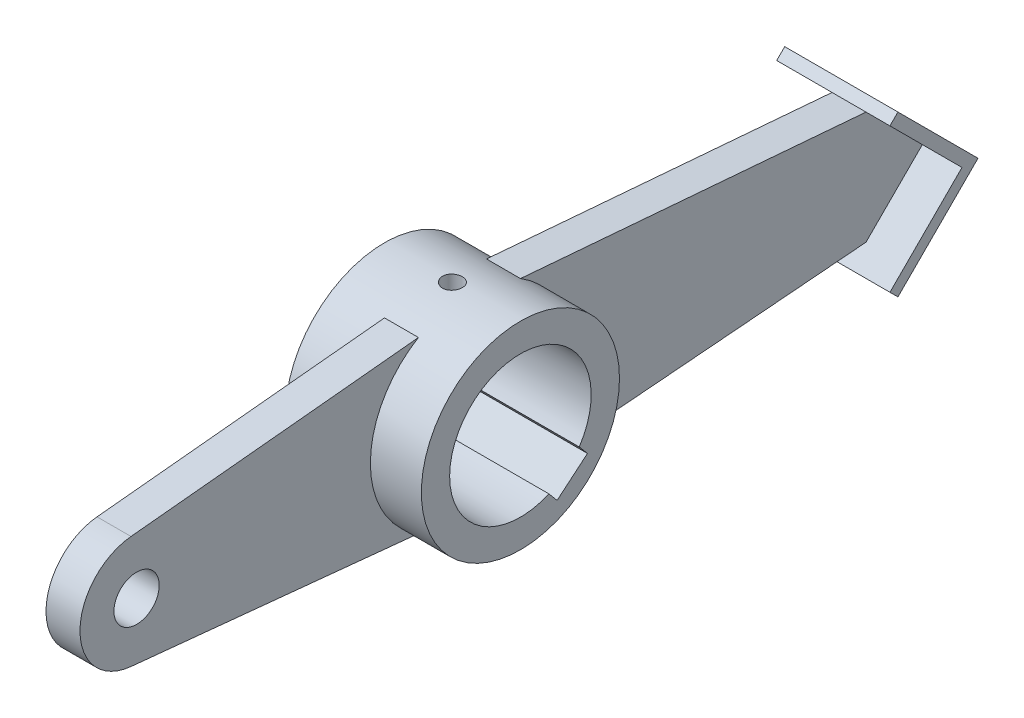
ISO-10303-21;
HEADER;
FILE_DESCRIPTION(('STEP AP214'),'2;1');
FILE_NAME('part.step','',(''),(''),'','','');
FILE_SCHEMA(('AUTOMOTIVE_DESIGN { 1 0 10303 214 1 1 1 1 }'));
ENDSEC;
DATA;
#1=APPLICATION_CONTEXT('core data for automotive mechanical design processes');
#2=APPLICATION_PROTOCOL_DEFINITION('international standard','automotive_design',2000,#1);
#3=PRODUCT_CONTEXT('',#1,'mechanical');
#4=PRODUCT('Part','Part','',(#3));
#5=PRODUCT_RELATED_PRODUCT_CATEGORY('part','',(#4));
#6=PRODUCT_DEFINITION_FORMATION('','',#4);
#7=PRODUCT_DEFINITION_CONTEXT('part definition',#1,'design');
#8=PRODUCT_DEFINITION('design','',#6,#7);
#9=PRODUCT_DEFINITION_SHAPE('','',#8);
#10=(LENGTH_UNIT() NAMED_UNIT(*) SI_UNIT(.MILLI.,.METRE.));
#11=(NAMED_UNIT(*) PLANE_ANGLE_UNIT() SI_UNIT($,.RADIAN.));
#12=(NAMED_UNIT(*) SI_UNIT($,.STERADIAN.) SOLID_ANGLE_UNIT());
#13=UNCERTAINTY_MEASURE_WITH_UNIT(LENGTH_MEASURE(1.E-05),#10,'distance_accuracy_value','');
#14=(GEOMETRIC_REPRESENTATION_CONTEXT(3) GLOBAL_UNCERTAINTY_ASSIGNED_CONTEXT((#13)) GLOBAL_UNIT_ASSIGNED_CONTEXT((#10,
#11,#12)) REPRESENTATION_CONTEXT('',''));
#15=CARTESIAN_POINT('',(0.,0.,0.));
#16=DIRECTION('',(0.,0.,1.));
#17=DIRECTION('',(1.,0.,0.));
#18=AXIS2_PLACEMENT_3D('',#15,#16,#17);
#19=CARTESIAN_POINT('',(20.,0.,-160.));
#20=DIRECTION('',(0.,0.707106781186547,-0.707106781186548));
#21=DIRECTION('',(0.,0.707106781186548,0.707106781186547));
#22=AXIS2_PLACEMENT_3D('',#19,#20,#21);
#23=PLANE('',#22);
#24=DIRECTION('',(0.,-0.707106781186548,-0.707106781186547));
#25=VECTOR('',#24,1.);
#26=CARTESIAN_POINT('',(-20.,0.,-160.));
#27=LINE('',#26,#25);
#28=CARTESIAN_POINT('',(-20.,25.4558441227157,-134.544155877284));
#29=VERTEX_POINT('',#28);
#30=CARTESIAN_POINT('',(-20.,0.,-160.));
#31=VERTEX_POINT('',#30);
#32=EDGE_CURVE('E130',#29,#31,#27,.T.);
#33=ORIENTED_EDGE('',*,*,#32,.T.);
#34=DIRECTION('',(-1.,0.,0.));
#35=VECTOR('',#34,1.);
#36=CARTESIAN_POINT('',(20.,0.,-160.));
#37=LINE('',#36,#35);
#38=CARTESIAN_POINT('',(20.,0.,-160.));
#39=VERTEX_POINT('',#38);
#40=EDGE_CURVE('E12',#39,#31,#37,.T.);
#41=ORIENTED_EDGE('',*,*,#40,.F.);
#42=DIRECTION('',(0.,-0.707106781186548,-0.707106781186547));
#43=VECTOR('',#42,1.);
#44=CARTESIAN_POINT('',(20.,0.,-160.));
#45=LINE('',#44,#43);
#46=CARTESIAN_POINT('',(20.,25.4558441227157,-134.544155877284));
#47=VERTEX_POINT('',#46);
#48=EDGE_CURVE('E140',#47,#39,#45,.T.);
#49=ORIENTED_EDGE('',*,*,#48,.F.);
#50=DIRECTION('',(-1.,0.,0.));
#51=VECTOR('',#50,1.);
#52=CARTESIAN_POINT('',(20.,25.4558441227157,-134.544155877284));
#53=LINE('',#52,#51);
#54=EDGE_CURVE('E126',#47,#29,#53,.T.);
#55=ORIENTED_EDGE('',*,*,#54,.T.);
#56=EDGE_LOOP('',(#33,#41,#49,#55));
#57=FACE_BOUND('',#56,.T.);
#58=ADVANCED_FACE('F46',(#57),#23,.F.);
#59=CARTESIAN_POINT('',(20.,-25.4558441227157,-134.544155877284));
#60=DIRECTION('',(0.,-0.707106781186547,-0.707106781186548));
#61=DIRECTION('',(0.,0.707106781186548,-0.707106781186547));
#62=AXIS2_PLACEMENT_3D('',#59,#60,#61);
#63=PLANE('',#62);
#64=DIRECTION('',(0.,-0.707106781186548,0.707106781186547));
#65=VECTOR('',#64,1.);
#66=CARTESIAN_POINT('',(-20.,-25.4558441227157,-134.544155877284));
#67=LINE('',#66,#65);
#68=CARTESIAN_POINT('',(-20.,-25.4558441227157,-134.544155877284));
#69=VERTEX_POINT('',#68);
#70=EDGE_CURVE('E133',#31,#69,#67,.T.);
#71=ORIENTED_EDGE('',*,*,#70,.T.);
#72=DIRECTION('',(-1.,0.,0.));
#73=VECTOR('',#72,1.);
#74=CARTESIAN_POINT('',(20.,-25.4558441227157,-134.544155877284));
#75=LINE('',#74,#73);
#76=CARTESIAN_POINT('',(20.,-25.4558441227157,-134.544155877284));
#77=VERTEX_POINT('',#76);
#78=EDGE_CURVE('E54',#77,#69,#75,.T.);
#79=ORIENTED_EDGE('',*,*,#78,.F.);
#80=DIRECTION('',(0.,-0.707106781186548,0.707106781186547));
#81=VECTOR('',#80,1.);
#82=CARTESIAN_POINT('',(20.,-25.4558441227157,-134.544155877284));
#83=LINE('',#82,#81);
#84=EDGE_CURVE('E99',#39,#77,#83,.T.);
#85=ORIENTED_EDGE('',*,*,#84,.F.);
#86=ORIENTED_EDGE('',*,*,#40,.T.);
#87=EDGE_LOOP('',(#71,#79,#85,#86));
#88=FACE_BOUND('',#87,.T.);
#89=ADVANCED_FACE('F164',(#88),#63,.F.);
#90=CARTESIAN_POINT('',(20.,-28.2842712474619,-137.372583002031));
#91=DIRECTION('',(0.,0.70710678118655,-0.707106781186545));
#92=DIRECTION('',(0.,0.707106781186545,0.70710678118655));
#93=AXIS2_PLACEMENT_3D('',#90,#91,#92);
#94=PLANE('',#93);
#95=DIRECTION('',(0.,-0.707106781186545,-0.70710678118655));
#96=VECTOR('',#95,1.);
#97=CARTESIAN_POINT('',(-20.,-28.2842712474619,-137.372583002031));
#98=LINE('',#97,#96);
#99=CARTESIAN_POINT('',(-20.,-28.2842712474619,-137.372583002031));
#100=VERTEX_POINT('',#99);
#101=EDGE_CURVE('E135',#69,#100,#98,.T.);
#102=ORIENTED_EDGE('',*,*,#101,.T.);
#103=DIRECTION('',(-1.,0.,0.));
#104=VECTOR('',#103,1.);
#105=CARTESIAN_POINT('',(20.,-28.2842712474619,-137.372583002031));
#106=LINE('',#105,#104);
#107=CARTESIAN_POINT('',(20.,-28.2842712474619,-137.372583002031));
#108=VERTEX_POINT('',#107);
#109=EDGE_CURVE('E121',#108,#100,#106,.T.);
#110=ORIENTED_EDGE('',*,*,#109,.F.);
#111=DIRECTION('',(0.,-0.707106781186545,-0.70710678118655));
#112=VECTOR('',#111,1.);
#113=CARTESIAN_POINT('',(20.,-28.2842712474619,-137.372583002031));
#114=LINE('',#113,#112);
#115=EDGE_CURVE('E112',#77,#108,#114,.T.);
#116=ORIENTED_EDGE('',*,*,#115,.F.);
#117=ORIENTED_EDGE('',*,*,#78,.T.);
#118=EDGE_LOOP('',(#102,#110,#116,#117));
#119=FACE_BOUND('',#118,.T.);
#120=ADVANCED_FACE('F146',(#119),#94,.F.);
#121=CARTESIAN_POINT('',(20.,0.,-165.656854249492));
#122=DIRECTION('',(0.,0.707106781186548,0.707106781186547));
#123=DIRECTION('',(0.,-0.707106781186547,0.707106781186548));
#124=AXIS2_PLACEMENT_3D('',#121,#122,#123);
#125=PLANE('',#124);
#126=DIRECTION('',(0.,0.707106781186547,-0.707106781186548));
#127=VECTOR('',#126,1.);
#128=CARTESIAN_POINT('',(-20.,0.,-165.656854249492));
#129=LINE('',#128,#127);
#130=CARTESIAN_POINT('',(-20.,0.,-165.656854249492));
#131=VERTEX_POINT('',#130);
#132=EDGE_CURVE('E120',#100,#131,#129,.T.);
#133=ORIENTED_EDGE('',*,*,#132,.T.);
#134=DIRECTION('',(-1.,0.,0.));
#135=VECTOR('',#134,1.);
#136=CARTESIAN_POINT('',(20.,0.,-165.656854249492));
#137=LINE('',#136,#135);
#138=CARTESIAN_POINT('',(20.,0.,-165.656854249492));
#139=VERTEX_POINT('',#138);
#140=EDGE_CURVE('E117',#139,#131,#137,.T.);
#141=ORIENTED_EDGE('',*,*,#140,.F.);
#142=DIRECTION('',(0.,0.707106781186547,-0.707106781186548));
#143=VECTOR('',#142,1.);
#144=CARTESIAN_POINT('',(20.,0.,-165.656854249492));
#145=LINE('',#144,#143);
#146=EDGE_CURVE('E106',#108,#139,#145,.T.);
#147=ORIENTED_EDGE('',*,*,#146,.F.);
#148=ORIENTED_EDGE('',*,*,#109,.T.);
#149=EDGE_LOOP('',(#133,#141,#147,#148));
#150=FACE_BOUND('',#149,.T.);
#151=ADVANCED_FACE('F118',(#150),#125,.F.);
#152=CARTESIAN_POINT('',(20.,28.2842712474619,-137.37258300203));
#153=DIRECTION('',(0.,-0.707106781186548,0.707106781186547));
#154=DIRECTION('',(0.,-0.707106781186547,-0.707106781186548));
#155=AXIS2_PLACEMENT_3D('',#152,#153,#154);
#156=PLANE('',#155);
#157=DIRECTION('',(0.,0.707106781186547,0.707106781186548));
#158=VECTOR('',#157,1.);
#159=CARTESIAN_POINT('',(-20.,28.2842712474619,-137.37258300203));
#160=LINE('',#159,#158);
#161=CARTESIAN_POINT('',(-20.,28.2842712474619,-137.37258300203));
#162=VERTEX_POINT('',#161);
#163=EDGE_CURVE('E85',#131,#162,#160,.T.);
#164=ORIENTED_EDGE('',*,*,#163,.T.);
#165=DIRECTION('',(-1.,0.,0.));
#166=VECTOR('',#165,1.);
#167=CARTESIAN_POINT('',(20.,28.2842712474619,-137.37258300203));
#168=LINE('',#167,#166);
#169=CARTESIAN_POINT('',(20.,28.2842712474619,-137.37258300203));
#170=VERTEX_POINT('',#169);
#171=EDGE_CURVE('E122',#170,#162,#168,.T.);
#172=ORIENTED_EDGE('',*,*,#171,.F.);
#173=DIRECTION('',(0.,0.707106781186547,0.707106781186548));
#174=VECTOR('',#173,1.);
#175=CARTESIAN_POINT('',(20.,28.2842712474619,-137.37258300203));
#176=LINE('',#175,#174);
#177=EDGE_CURVE('E110',#139,#170,#176,.T.);
#178=ORIENTED_EDGE('',*,*,#177,.F.);
#179=ORIENTED_EDGE('',*,*,#140,.T.);
#180=EDGE_LOOP('',(#164,#172,#178,#179));
#181=FACE_BOUND('',#180,.T.);
#182=ADVANCED_FACE('F124',(#181),#156,.F.);
#183=CARTESIAN_POINT('',(20.,25.4558441227157,-134.544155877284));
#184=DIRECTION('',(0.,-0.707106781186542,-0.707106781186553));
#185=DIRECTION('',(0.,0.707106781186553,-0.707106781186542));
#186=AXIS2_PLACEMENT_3D('',#183,#184,#185);
#187=PLANE('',#186);
#188=DIRECTION('',(0.,-0.707106781186553,0.707106781186542));
#189=VECTOR('',#188,1.);
#190=CARTESIAN_POINT('',(-20.,25.4558441227157,-134.544155877284));
#191=LINE('',#190,#189);
#192=EDGE_CURVE('E91',#162,#29,#191,.T.);
#193=ORIENTED_EDGE('',*,*,#192,.T.);
#194=ORIENTED_EDGE('',*,*,#54,.F.);
#195=DIRECTION('',(0.,-0.707106781186553,0.707106781186542));
#196=VECTOR('',#195,1.);
#197=CARTESIAN_POINT('',(20.,25.4558441227157,-134.544155877284));
#198=LINE('',#197,#196);
#199=EDGE_CURVE('E62',#170,#47,#198,.T.);
#200=ORIENTED_EDGE('',*,*,#199,.F.);
#201=ORIENTED_EDGE('',*,*,#171,.T.);
#202=EDGE_LOOP('',(#193,#194,#200,#201));
#203=FACE_BOUND('',#202,.T.);
#204=ADVANCED_FACE('F153',(#203),#187,.F.);
#205=CARTESIAN_POINT('',(20.,0.,0.));
#206=DIRECTION('',(-1.,0.,0.));
#207=DIRECTION('',(0.,0.,1.));
#208=AXIS2_PLACEMENT_3D('',#205,#206,#207);
#209=PLANE('',#208);
#210=ORIENTED_EDGE('',*,*,#48,.T.);
#211=ORIENTED_EDGE('',*,*,#84,.T.);
#212=ORIENTED_EDGE('',*,*,#115,.T.);
#213=ORIENTED_EDGE('',*,*,#146,.T.);
#214=ORIENTED_EDGE('',*,*,#177,.T.);
#215=ORIENTED_EDGE('',*,*,#199,.T.);
#216=EDGE_LOOP('',(#210,#211,#212,#213,#214,#215));
#217=FACE_BOUND('',#216,.T.);
#218=ADVANCED_FACE('F108',(#217),#209,.F.);
#219=CARTESIAN_POINT('',(-20.,0.,0.));
#220=DIRECTION('',(-1.,0.,0.));
#221=DIRECTION('',(0.,0.,1.));
#222=AXIS2_PLACEMENT_3D('',#219,#220,#221);
#223=PLANE('',#222);
#224=ORIENTED_EDGE('',*,*,#32,.F.);
#225=ORIENTED_EDGE('',*,*,#192,.F.);
#226=ORIENTED_EDGE('',*,*,#163,.F.);
#227=ORIENTED_EDGE('',*,*,#132,.F.);
#228=ORIENTED_EDGE('',*,*,#101,.F.);
#229=ORIENTED_EDGE('',*,*,#70,.F.);
#230=EDGE_LOOP('',(#224,#225,#226,#227,#228,#229));
#231=FACE_BOUND('',#230,.T.);
#232=ADVANCED_FACE('F149',(#231),#223,.T.);
#233=CLOSED_SHELL('',(#58,#89,#120,#151,#182,#204,#218,#232));
#234=MANIFOLD_SOLID_BREP('B2',#233);
#235=CARTESIAN_POINT('',(24.,0.,0.));
#236=DIRECTION('',(1.,0.,0.));
#237=DIRECTION('',(0.,0.,-1.));
#238=AXIS2_PLACEMENT_3D('',#235,#236,#237);
#239=PLANE('',#238);
#240=DIRECTION('',(0.,0.76604444311897,0.642787609686549));
#241=VECTOR('',#240,1.);
#242=CARTESIAN_POINT('',(24.,-6.65561581062619,-14.7225757972803));
#243=LINE('',#242,#241);
#244=CARTESIAN_POINT('',(24.,-17.3327533610848,-23.6817579778994));
#245=VERTEX_POINT('',#244);
#246=CARTESIAN_POINT('',(24.,-13.8855533670494,-20.78921373431));
#247=VERTEX_POINT('',#246);
#248=EDGE_CURVE('E347',#245,#247,#243,.T.);
#249=ORIENTED_EDGE('',*,*,#248,.F.);
#250=DIRECTION('',(0.,0.642787609686549,-0.76604444311897));
#251=VECTOR('',#250,1.);
#252=CARTESIAN_POINT('',(24.,-17.3327533610848,-23.6817579778994));
#253=LINE('',#252,#251);
#254=CARTESIAN_POINT('',(24.,-26.3317798966965,-12.9571357742339));
#255=VERTEX_POINT('',#254);
#256=EDGE_CURVE('E343',#255,#245,#253,.T.);
#257=ORIENTED_EDGE('',*,*,#256,.F.);
#258=DIRECTION('',(0.,-0.76604444311897,-0.642787609686549));
#259=VECTOR('',#258,1.);
#260=CARTESIAN_POINT('',(24.,-26.3317798966965,-12.9571357742339));
#261=LINE('',#260,#259);
#262=CARTESIAN_POINT('',(24.,-22.8845799026611,-10.0645915306444));
#263=VERTEX_POINT('',#262);
#264=EDGE_CURVE('E324',#263,#255,#261,.T.);
#265=ORIENTED_EDGE('',*,*,#264,.F.);
#266=CARTESIAN_POINT('',(24.,0.,0.));
#267=DIRECTION('',(1.,0.,0.));
#268=DIRECTION('',(0.,0.,-1.));
#269=AXIS2_PLACEMENT_3D('',#266,#267,#268);
#270=CIRCLE('',#269,25.);
#271=EDGE_CURVE('E424',#247,#263,#270,.T.);
#272=ORIENTED_EDGE('',*,*,#271,.F.);
#273=EDGE_LOOP('',(#249,#257,#265,#272));
#274=FACE_BOUND('',#273,.T.);
#275=CARTESIAN_POINT('',(24.,0.,0.));
#276=DIRECTION('',(1.,0.,0.));
#277=DIRECTION('',(0.,0.,-1.));
#278=AXIS2_PLACEMENT_3D('',#275,#276,#277);
#279=CIRCLE('',#278,35.);
#280=CARTESIAN_POINT('',(24.,0.,-35.));
#281=VERTEX_POINT('',#280);
#282=EDGE_CURVE('E429',#281,#281,#279,.T.);
#283=ORIENTED_EDGE('',*,*,#282,.T.);
#284=EDGE_LOOP('',(#283));
#285=FACE_BOUND('',#284,.T.);
#286=ADVANCED_FACE('F221',(#274,#285),#239,.T.);
#287=CARTESIAN_POINT('',(-24.,0.,0.));
#288=DIRECTION('',(1.,0.,0.));
#289=DIRECTION('',(0.,0.,-1.));
#290=AXIS2_PLACEMENT_3D('',#287,#288,#289);
#291=PLANE('',#290);
#292=CARTESIAN_POINT('',(-24.,0.,0.));
#293=DIRECTION('',(1.,0.,0.));
#294=DIRECTION('',(0.,0.,-1.));
#295=AXIS2_PLACEMENT_3D('',#292,#293,#294);
#296=CIRCLE('',#295,35.);
#297=CARTESIAN_POINT('',(-24.,0.,-35.));
#298=VERTEX_POINT('',#297);
#299=EDGE_CURVE('E427',#298,#298,#296,.T.);
#300=ORIENTED_EDGE('',*,*,#299,.F.);
#301=EDGE_LOOP('',(#300));
#302=FACE_BOUND('',#301,.T.);
#303=DIRECTION('',(0.,0.642787609686549,-0.76604444311897));
#304=VECTOR('',#303,1.);
#305=CARTESIAN_POINT('',(-24.,-17.3327533610848,-23.6817579778994));
#306=LINE('',#305,#304);
#307=CARTESIAN_POINT('',(-24.,-26.3317798966965,-12.9571357742339));
#308=VERTEX_POINT('',#307);
#309=CARTESIAN_POINT('',(-24.,-17.3327533610848,-23.6817579778994));
#310=VERTEX_POINT('',#309);
#311=EDGE_CURVE('E329',#308,#310,#306,.T.);
#312=ORIENTED_EDGE('',*,*,#311,.T.);
#313=DIRECTION('',(0.,0.76604444311897,0.642787609686549));
#314=VECTOR('',#313,1.);
#315=CARTESIAN_POINT('',(-24.,-6.65561581062619,-14.7225757972803));
#316=LINE('',#315,#314);
#317=CARTESIAN_POINT('',(-24.,-13.8855533670494,-20.78921373431));
#318=VERTEX_POINT('',#317);
#319=EDGE_CURVE('E341',#310,#318,#316,.T.);
#320=ORIENTED_EDGE('',*,*,#319,.T.);
#321=CARTESIAN_POINT('',(-24.,0.,0.));
#322=DIRECTION('',(1.,0.,0.));
#323=DIRECTION('',(0.,0.,-1.));
#324=AXIS2_PLACEMENT_3D('',#321,#322,#323);
#325=CIRCLE('',#324,25.);
#326=CARTESIAN_POINT('',(-24.,-22.8845799026611,-10.0645915306444));
#327=VERTEX_POINT('',#326);
#328=EDGE_CURVE('E340',#318,#327,#325,.T.);
#329=ORIENTED_EDGE('',*,*,#328,.T.);
#330=DIRECTION('',(0.,-0.76604444311897,-0.642787609686549));
#331=VECTOR('',#330,1.);
#332=CARTESIAN_POINT('',(-24.,-26.3317798966965,-12.9571357742339));
#333=LINE('',#332,#331);
#334=EDGE_CURVE('E243',#327,#308,#333,.T.);
#335=ORIENTED_EDGE('',*,*,#334,.T.);
#336=EDGE_LOOP('',(#312,#320,#329,#335));
#337=FACE_BOUND('',#336,.T.);
#338=ADVANCED_FACE('F338',(#302,#337),#291,.F.);
#339=CARTESIAN_POINT('',(24.,0.,0.));
#340=DIRECTION('',(-1.,0.,0.));
#341=DIRECTION('',(0.,0.,1.));
#342=AXIS2_PLACEMENT_3D('',#339,#340,#341);
#343=CYLINDRICAL_SURFACE('',#342,35.);
#344=CARTESIAN_POINT('',(0.,34.8245602987317,3.49999999999988));
#345=CARTESIAN_POINT('',(-0.196068474615196,34.8245625976248,3.4999915068767));
#346=CARTESIAN_POINT('',(-0.392266589464245,34.8262339934706,3.48346900643453));
#347=CARTESIAN_POINT('',(-0.779223152048499,34.8327380631546,3.41780710166835));
#348=CARTESIAN_POINT('',(-0.969975363135411,34.8375742207731,3.36863175210201));
#349=CARTESIAN_POINT('',(-1.34038036725521,34.8498546570279,3.23911040624265));
#350=CARTESIAN_POINT('',(-1.52003981286804,34.8572973542366,3.15878330702893));
#351=CARTESIAN_POINT('',(-1.86328727302312,34.8739503199148,2.96927493586832));
#352=CARTESIAN_POINT('',(-2.02687847069355,34.883160237225,2.86009939469051));
#353=CARTESIAN_POINT('',(-2.33397942280071,34.9023474348731,2.61556666699545));
#354=CARTESIAN_POINT('',(-2.4774225332631,34.9123271001915,2.48012596337881));
#355=CARTESIAN_POINT('',(-2.73958163151263,34.931907683243,2.18708600361832));
#356=CARTESIAN_POINT('',(-2.85829648792213,34.9415085836306,2.02948573417286));
#357=CARTESIAN_POINT('',(-3.06785939952499,34.9592734104481,1.69619226577834));
#358=CARTESIAN_POINT('',(-3.15864849577781,34.9674342813132,1.52046181885337));
#359=CARTESIAN_POINT('',(-3.3094055160204,34.9813735906515,1.15615494500616));
#360=CARTESIAN_POINT('',(-3.36937419129314,34.9871520871971,0.967578831338643));
#361=CARTESIAN_POINT('',(-3.45659268273637,34.995658829986,0.583606739600202));
#362=CARTESIAN_POINT('',(-3.48395191462481,34.9983972744986,0.388235844610414));
#363=CARTESIAN_POINT('',(-3.50551344196801,35.0005500459542,-0.00434259241142233));
#364=CARTESIAN_POINT('',(-3.49971659711196,34.9999644590845,-0.201550086690736));
#365=CARTESIAN_POINT('',(-3.45521934572445,34.9955434958915,-0.591460954226082));
#366=CARTESIAN_POINT('',(-3.41663659552638,34.99171974031,-0.784177904772548));
#367=CARTESIAN_POINT('',(-3.30784604868683,34.9812655242726,-1.16038712826599));
#368=CARTESIAN_POINT('',(-3.2376378412435,34.9746350273584,-1.34387928135217));
#369=CARTESIAN_POINT('',(-3.06746032860946,34.959292811937,-1.69680110137867));
#370=CARTESIAN_POINT('',(-2.96743895864445,34.9505774578015,-1.8662054984359));
#371=CARTESIAN_POINT('',(-2.74051216832271,34.9320434581793,-2.1858672961098));
#372=CARTESIAN_POINT('',(-2.61360595949186,34.9222247803384,-2.33612413496302));
#373=CARTESIAN_POINT('',(-2.33585019670224,34.9025352713748,-2.61391470137953));
#374=CARTESIAN_POINT('',(-2.18489829340448,34.892664400056,-2.74134611166633));
#375=CARTESIAN_POINT('',(-1.86369097176228,34.8740258974878,-2.96907637375283));
#376=CARTESIAN_POINT('',(-1.6934355254175,34.8652582678387,-3.06937518619524));
#377=CARTESIAN_POINT('',(-1.33837541180073,34.8498181329952,-3.23999264600643));
#378=CARTESIAN_POINT('',(-1.15356768651989,34.8431460696394,-3.31030497200548));
#379=CARTESIAN_POINT('',(-0.77468788384859,34.8326615654828,-3.41887257473168));
#380=CARTESIAN_POINT('',(-0.580616088893944,34.8288490375619,-3.45712882810074));
#381=CARTESIAN_POINT('',(-0.189615371646723,34.8245303184596,-3.50036671387198));
#382=CARTESIAN_POINT('',(0.00729757092691552,34.8240099041661,-3.50549148826536));
#383=CARTESIAN_POINT('',(0.39917943038002,34.826296797417,-3.48269686404989));
#384=CARTESIAN_POINT('',(0.594148373491285,34.8291040599971,-3.45477791193426));
#385=CARTESIAN_POINT('',(0.976190537974195,34.8377170547841,-3.36680811077644));
#386=CARTESIAN_POINT('',(1.16327949883131,34.8435164700471,-3.3068249451613));
#387=CARTESIAN_POINT('',(1.52474018105607,34.8574551863578,-3.15649851886591));
#388=CARTESIAN_POINT('',(1.69911161100514,34.8655945410034,-3.06615456274268));
#389=CARTESIAN_POINT('',(2.03083990910072,34.88333045245,-2.85731250498138));
#390=CARTESIAN_POINT('',(2.18813679688189,34.8929318785135,-2.73871954944254));
#391=CARTESIAN_POINT('',(2.48064268645923,34.9124941418815,-2.47688186707923));
#392=CARTESIAN_POINT('',(2.61585114119027,34.9224549880803,-2.33363652986859));
#393=CARTESIAN_POINT('',(2.86083571689332,34.9416566747256,-2.02593931479278));
#394=CARTESIAN_POINT('',(2.97051845855177,34.9508947919416,-1.8614128958932));
#395=CARTESIAN_POINT('',(3.16069553977244,34.9675704737321,-1.51619201096008));
#396=CARTESIAN_POINT('',(3.24119027927486,34.9750080629773,-1.33549776650381));
#397=CARTESIAN_POINT('',(3.37054818679367,34.9872323644902,-0.963396442514975));
#398=CARTESIAN_POINT('',(3.41946775563825,34.9920238011977,-0.77200913177498));
#399=CARTESIAN_POINT('',(3.48447074352945,34.9984353114778,-0.383686848942998));
#400=CARTESIAN_POINT('',(3.50055508541913,35.0000554741798,-0.186752032922882));
#401=CARTESIAN_POINT('',(3.4994180674602,34.9999418409643,0.206157784264988));
#402=CARTESIAN_POINT('',(3.48234167107171,34.998222643183,0.402133225285718));
#403=CARTESIAN_POINT('',(3.41567189020057,34.9916522752161,0.788416609247154));
#404=CARTESIAN_POINT('',(3.36607848019455,34.9868011025722,0.978724547739183));
#405=CARTESIAN_POINT('',(3.23582259912479,34.974510333487,1.34826968068696));
#406=CARTESIAN_POINT('',(3.15516436573066,34.9670710901076,1.52750838127113));
#407=CARTESIAN_POINT('',(2.96508390879036,34.9504334345765,1.86992610054176));
#408=CARTESIAN_POINT('',(2.8556618535503,34.9412350327182,2.03310521319019));
#409=CARTESIAN_POINT('',(2.61061633341766,34.9220614633941,2.33951453549381));
#410=CARTESIAN_POINT('',(2.47488494314616,34.9120832010391,2.48265824176625));
#411=CARTESIAN_POINT('',(2.18128626958798,34.8925006770235,2.74420215787719));
#412=CARTESIAN_POINT('',(2.0234136818972,34.882896505691,2.86259642147227));
#413=CARTESIAN_POINT('',(1.68957480328959,34.8651234190513,3.07151824148024));
#414=CARTESIAN_POINT('',(1.51356351540338,34.8569582161914,3.16197415796529));
#415=CARTESIAN_POINT('',(1.14888098067601,34.8430318155411,3.31192647832916));
#416=CARTESIAN_POINT('',(0.960224286269832,34.8372679076444,3.37145780261068));
#417=CARTESIAN_POINT('',(0.642082906848253,34.8302502639813,3.44302590916929));
#418=CARTESIAN_POINT('',(0.514632120425643,34.828126617742,3.4643619933941));
#419=CARTESIAN_POINT('',(0.258139619352917,34.8252808812256,3.49285180511734));
#420=CARTESIAN_POINT('',(0.129097911383504,34.8245587850651,3.50000559215061));
#421=CARTESIAN_POINT('',(0.,34.8245602987317,3.49999999999988));
#422=B_SPLINE_CURVE_WITH_KNOTS('',3,(#344,#345,#346,#347,#348,#349,#350,#351,#352,#353,#354,
#355,#356,#357,#358,#359,#360,#361,#362,#363,#364,#365,#366,#367,#368,#369,#370,#371,#372,#373,
#374,#375,#376,#377,#378,#379,#380,#381,#382,#383,#384,#385,#386,#387,#388,#389,#390,#391,#392,
#393,#394,#395,#396,#397,#398,#399,#400,#401,#402,#403,#404,#405,#406,#407,#408,#409,#410,#411,
#412,#413,#414,#415,#416,#417,#418,#419,#420,#421),.UNSPECIFIED.,.T.,.F.,(4,2,2,2,2,2,2,2,2,2,2,
2,2,2,2,2,2,2,2,2,2,2,2,2,2,2,2,2,2,2,2,2,2,2,2,2,2,2,4),(0.,0.58773398053861,1.17611603139755,
1.76414171851251,2.35205068149596,2.94186065356873,3.53169760495521,4.12277144901656,
4.71383088429417,5.30290148146709,5.89195680495949,6.47890711367451,7.06586504685546,
7.65385409134583,8.24186038266986,8.8324398779964,9.42302022998605,10.013725019149,
10.6044118108475,11.1925448707931,11.7806699838618,12.3675585146798,12.954460489658,
13.5433616434315,14.1322773803334,14.7233147886555,15.3143440981515,15.904314744324,
16.4942688089816,17.0816496714183,17.6690309949044,18.256332219855,18.8436300083993,
19.4333900263509,20.0232915762297,20.6146934374943,21.2054260213252,21.5924109662468,
21.9793942866687),.UNSPECIFIED.);
#423=CARTESIAN_POINT('',(0.,34.8245602987317,3.49999999999988));
#424=VERTEX_POINT('',#423);
#425=EDGE_CURVE('E349',#424,#424,#422,.T.);
#426=ORIENTED_EDGE('',*,*,#425,.T.);
#427=EDGE_LOOP('',(#426));
#428=FACE_BOUND('',#427,.T.);
#429=DIRECTION('',(-1.,0.,0.));
#430=VECTOR('',#429,1.);
#431=CARTESIAN_POINT('',(6.,-30.,-18.02775637732));
#432=LINE('',#431,#430);
#433=CARTESIAN_POINT('',(6.,-30.,-18.02775637732));
#434=VERTEX_POINT('',#433);
#435=CARTESIAN_POINT('',(-6.,-30.,-18.02775637732));
#436=VERTEX_POINT('',#435);
#437=EDGE_CURVE('E251',#434,#436,#432,.T.);
#438=ORIENTED_EDGE('',*,*,#437,.F.);
#439=CARTESIAN_POINT('',(6.,0.,0.));
#440=DIRECTION('',(1.,0.,0.));
#441=DIRECTION('',(0.,0.,-1.));
#442=AXIS2_PLACEMENT_3D('',#439,#440,#441);
#443=CIRCLE('',#442,35.);
#444=CARTESIAN_POINT('',(6.,30.,-18.02775637732));
#445=VERTEX_POINT('',#444);
#446=EDGE_CURVE('E357',#445,#434,#443,.F.);
#447=ORIENTED_EDGE('',*,*,#446,.F.);
#448=DIRECTION('',(-1.,0.,0.));
#449=VECTOR('',#448,1.);
#450=CARTESIAN_POINT('',(6.,30.,-18.02775637732));
#451=LINE('',#450,#449);
#452=CARTESIAN_POINT('',(-6.,30.,-18.02775637732));
#453=VERTEX_POINT('',#452);
#454=EDGE_CURVE('E372',#445,#453,#451,.T.);
#455=ORIENTED_EDGE('',*,*,#454,.T.);
#456=CARTESIAN_POINT('',(-6.,0.,0.));
#457=DIRECTION('',(1.,0.,0.));
#458=DIRECTION('',(0.,0.,-1.));
#459=AXIS2_PLACEMENT_3D('',#456,#457,#458);
#460=CIRCLE('',#459,35.);
#461=EDGE_CURVE('E373',#453,#436,#460,.F.);
#462=ORIENTED_EDGE('',*,*,#461,.T.);
#463=EDGE_LOOP('',(#438,#447,#455,#462));
#464=FACE_BOUND('',#463,.T.);
#465=DIRECTION('',(-1.,0.,0.));
#466=VECTOR('',#465,1.);
#467=CARTESIAN_POINT('',(6.,30.,18.02775637732));
#468=LINE('',#467,#466);
#469=CARTESIAN_POINT('',(6.,30.,18.02775637732));
#470=VERTEX_POINT('',#469);
#471=CARTESIAN_POINT('',(-6.,30.,18.02775637732));
#472=VERTEX_POINT('',#471);
#473=EDGE_CURVE('E421',#470,#472,#468,.T.);
#474=ORIENTED_EDGE('',*,*,#473,.F.);
#475=CARTESIAN_POINT('',(6.,0.,0.));
#476=DIRECTION('',(1.,0.,0.));
#477=DIRECTION('',(0.,0.,-1.));
#478=AXIS2_PLACEMENT_3D('',#475,#476,#477);
#479=CIRCLE('',#478,35.);
#480=CARTESIAN_POINT('',(6.,-30.,18.02775637732));
#481=VERTEX_POINT('',#480);
#482=EDGE_CURVE('E395',#470,#481,#479,.T.);
#483=ORIENTED_EDGE('',*,*,#482,.T.);
#484=DIRECTION('',(-1.,0.,0.));
#485=VECTOR('',#484,1.);
#486=CARTESIAN_POINT('',(6.,-30.,18.02775637732));
#487=LINE('',#486,#485);
#488=CARTESIAN_POINT('',(-6.,-30.,18.02775637732));
#489=VERTEX_POINT('',#488);
#490=EDGE_CURVE('E405',#481,#489,#487,.T.);
#491=ORIENTED_EDGE('',*,*,#490,.T.);
#492=CARTESIAN_POINT('',(-6.,0.,0.));
#493=DIRECTION('',(1.,0.,0.));
#494=DIRECTION('',(0.,0.,-1.));
#495=AXIS2_PLACEMENT_3D('',#492,#493,#494);
#496=CIRCLE('',#495,35.);
#497=EDGE_CURVE('E394',#472,#489,#496,.T.);
#498=ORIENTED_EDGE('',*,*,#497,.F.);
#499=EDGE_LOOP('',(#474,#483,#491,#498));
#500=FACE_BOUND('',#499,.T.);
#501=ORIENTED_EDGE('',*,*,#282,.F.);
#502=EDGE_LOOP('',(#501));
#503=FACE_BOUND('',#502,.T.);
#504=ORIENTED_EDGE('',*,*,#299,.T.);
#505=EDGE_LOOP('',(#504));
#506=FACE_BOUND('',#505,.T.);
#507=ADVANCED_FACE('F223',(#428,#464,#500,#503,#506),#343,.T.);
#508=CARTESIAN_POINT('',(24.,0.,0.));
#509=DIRECTION('',(-1.,0.,0.));
#510=DIRECTION('',(0.,0.,1.));
#511=AXIS2_PLACEMENT_3D('',#508,#509,#510);
#512=CYLINDRICAL_SURFACE('',#511,25.);
#513=CARTESIAN_POINT('',(0.,24.7537875889731,3.49999999999991));
#514=CARTESIAN_POINT('',(-0.195560154767575,24.7537906822583,3.49999181655899));
#515=CARTESIAN_POINT('',(-0.391237507482555,24.7561300920155,3.48355443558917));
#516=CARTESIAN_POINT('',(-0.777131922734741,24.76522981384,3.41825061741048));
#517=CARTESIAN_POINT('',(-0.967343298780199,24.7719945675026,3.36935159862291));
#518=CARTESIAN_POINT('',(-1.33666359330411,24.7891640928697,3.2406069700329));
#519=CARTESIAN_POINT('',(-1.51578050601989,24.7995662068558,3.16078395095821));
#520=CARTESIAN_POINT('',(-1.85804877360261,24.8228352266466,2.97250847563916));
#521=CARTESIAN_POINT('',(-2.02120254431549,24.8357017586143,2.86406036070275));
#522=CARTESIAN_POINT('',(-2.32808215853283,24.8625504844522,2.62080281251517));
#523=CARTESIAN_POINT('',(-2.47168026194528,24.8765391460462,2.48583292443012));
#524=CARTESIAN_POINT('',(-2.73426680506273,24.9039980636581,2.1937092685364));
#525=CARTESIAN_POINT('',(-2.85325394710894,24.9174682923102,2.03655433171439));
#526=CARTESIAN_POINT('',(-3.06370718457442,24.9424397352459,1.7037092427827));
#527=CARTESIAN_POINT('',(-3.15505643492662,24.9539325035401,1.5279445235744));
#528=CARTESIAN_POINT('',(-3.30689160701615,24.9735826810557,1.16337996516009));
#529=CARTESIAN_POINT('',(-3.36737895417656,24.9817402443171,0.974580728438527));
#530=CARTESIAN_POINT('',(-3.45538823852594,24.9937552741093,0.590618783329255));
#531=CARTESIAN_POINT('',(-3.48312354003459,24.9976405609784,0.39550586551262));
#532=CARTESIAN_POINT('',(-3.50550340939038,25.0007684801016,0.00335922712109844));
#533=CARTESIAN_POINT('',(-3.50014959052891,25.0000113387018,-0.193674399340166));
#534=CARTESIAN_POINT('',(-3.45667267130987,24.9939620558024,-0.582615400058849));
#535=CARTESIAN_POINT('',(-3.41877908235907,24.9887016775951,-0.77454899363336));
#536=CARTESIAN_POINT('',(-3.31165791632868,24.9742724352295,-1.1493059403018));
#537=CARTESIAN_POINT('',(-3.2424296191148,24.9651034812448,-1.33212908391216));
#538=CARTESIAN_POINT('',(-3.07436539311271,24.9438325860369,-1.68417680329696));
#539=CARTESIAN_POINT('',(-2.97543170896317,24.9317209865754,-1.85335410431128));
#540=CARTESIAN_POINT('',(-2.75083632806707,24.9059168552186,-2.17279223786532));
#541=CARTESIAN_POINT('',(-2.6251730960448,24.8922242325342,-2.32305198304032));
#542=CARTESIAN_POINT('',(-2.34940423165519,24.8646488503525,-2.60174071972411));
#543=CARTESIAN_POINT('',(-2.19909835937842,24.8507654670317,-2.72997158820316));
#544=CARTESIAN_POINT('',(-1.87899432350826,24.8244883316295,-2.95941854341821));
#545=CARTESIAN_POINT('',(-1.70919606731678,24.8120945866252,-3.06063450181293));
#546=CARTESIAN_POINT('',(-1.35473337110271,24.7902003566841,-3.23319870278271));
#547=CARTESIAN_POINT('',(-1.17005982427998,24.7807016614096,-3.30452848048132));
#548=CARTESIAN_POINT('',(-0.791192209672886,24.7657059743542,-3.41510621643369));
#549=CARTESIAN_POINT('',(-0.596998723344254,24.7602087384978,-3.45435613146944));
#550=CARTESIAN_POINT('',(-0.206360947689206,24.7538840422246,-3.49939221005379));
#551=CARTESIAN_POINT('',(-0.00994954822496354,24.7530175108533,-3.50545836748379));
#552=CARTESIAN_POINT('',(0.381086893072054,24.755948778245,-3.48469592776285));
#553=CARTESIAN_POINT('',(0.575711982828229,24.7597464515054,-3.45786821570808));
#554=CARTESIAN_POINT('',(0.956795666068332,24.7715424400724,-3.37231633400967));
#555=CARTESIAN_POINT('',(1.14328581530875,24.7795225973313,-3.3137300054231));
#556=CARTESIAN_POINT('',(1.50379762778359,24.7987695354145,-3.16646669264694));
#557=CARTESIAN_POINT('',(1.67781874866506,24.8100364590921,-3.07778840053819));
#558=CARTESIAN_POINT('',(2.00971273491393,24.8346801452907,-2.87217909544431));
#559=CARTESIAN_POINT('',(2.16747168569053,24.8480703159863,-2.75506583601389));
#560=CARTESIAN_POINT('',(2.4611957887449,24.875410682501,-2.49616615385776));
#561=CARTESIAN_POINT('',(2.59715987130254,24.8893609057662,-2.35437852079399));
#562=CARTESIAN_POINT('',(2.84443100323985,24.9163707911093,-2.04892599936437));
#563=CARTESIAN_POINT('',(2.95555315271703,24.9294233048069,-1.8851107059176));
#564=CARTESIAN_POINT('',(3.14870159069414,24.9530578482668,-1.54097657080121));
#565=CARTESIAN_POINT('',(3.2307285895544,24.9636399383426,-1.36065813219238));
#566=CARTESIAN_POINT('',(3.36305865647722,24.9811098395859,-0.989229139282875));
#567=CARTESIAN_POINT('',(3.4134652371279,24.9880096937281,-0.798156053861498));
#568=CARTESIAN_POINT('',(3.4814593912701,24.9973880303632,-0.410154489530087));
#569=CARTESIAN_POINT('',(3.49904884140295,24.9998667656766,-0.21322634609474));
#570=CARTESIAN_POINT('',(3.5008681558451,25.000121613377,0.179096941501349));
#571=CARTESIAN_POINT('',(3.48538184019311,24.9979377352712,0.374490803444288));
#572=CARTESIAN_POINT('',(3.42209452891469,24.9891929064383,0.759868138965443));
#573=CARTESIAN_POINT('',(3.37429359967922,24.9826319647038,0.949851623658541));
#574=CARTESIAN_POINT('',(3.24782988921627,24.9658667061347,1.31895434116059));
#575=CARTESIAN_POINT('',(3.16918424064728,24.9556644121669,1.49807954152811));
#576=CARTESIAN_POINT('',(2.98329332105218,24.9327408556312,1.84063575824949));
#577=CARTESIAN_POINT('',(2.87604736542495,24.9200195327676,2.00406639879774));
#578=CARTESIAN_POINT('',(2.63496342765128,24.8933445340092,2.31203862615948));
#579=CARTESIAN_POINT('',(2.50091509911646,24.8793816286934,2.45641476524119));
#580=CARTESIAN_POINT('',(2.21047306678788,24.8518678878302,2.72072938480244));
#581=CARTESIAN_POINT('',(2.05407411017749,24.8383171500605,2.84066210449918));
#582=CARTESIAN_POINT('',(1.72248429059404,24.8130916210476,3.05319975931045));
#583=CARTESIAN_POINT('',(1.54720581657095,24.801426264232,3.14566908745307));
#584=CARTESIAN_POINT('',(1.18353239989126,24.7814027288131,3.29972220584228));
#585=CARTESIAN_POINT('',(0.995151587980839,24.7730410503233,3.36133869990577));
#586=CARTESIAN_POINT('',(0.671556886996481,24.7625452599898,3.43762752385736));
#587=CARTESIAN_POINT('',(0.538360644804012,24.759278094514,3.46098233554839));
#588=CARTESIAN_POINT('',(0.270128231058788,24.7548982019194,3.49217131855808));
#589=CARTESIAN_POINT('',(0.13509207886887,24.7537854521456,3.50000565308425));
#590=CARTESIAN_POINT('',(0.,24.7537875889731,3.49999999999991));
#591=B_SPLINE_CURVE_WITH_KNOTS('',3,(#513,#514,#515,#516,#517,#518,#519,#520,#521,#522,#523,
#524,#525,#526,#527,#528,#529,#530,#531,#532,#533,#534,#535,#536,#537,#538,#539,#540,#541,#542,
#543,#544,#545,#546,#547,#548,#549,#550,#551,#552,#553,#554,#555,#556,#557,#558,#559,#560,#561,
#562,#563,#564,#565,#566,#567,#568,#569,#570,#571,#572,#573,#574,#575,#576,#577,#578,#579,#580,
#581,#582,#583,#584,#585,#586,#587,#588,#589,#590),.UNSPECIFIED.,.T.,.F.,(4,2,2,2,2,2,2,2,2,2,2,
2,2,2,2,2,2,2,2,2,2,2,2,2,2,2,2,2,2,2,2,2,2,2,2,2,2,2,4),(0.,0.586186802715839,1.17296284945572,
1.75931104800062,2.34557037149055,2.93549224141235,3.52544520813938,4.11785855282521,
4.71024453315484,5.29874972351533,5.88722622097413,6.47158581791365,7.05595884528782,
7.64227642364724,8.22862768766166,8.82000392576343,9.41138297329996,10.0031268615642,
10.5948346524106,11.1815420123042,11.7682335856381,12.3523989110571,12.9365896299306,
13.5246282706496,14.1126957642295,14.7050044334248,15.2972986403631,15.887643653788,
16.4779549074112,17.0632211173544,17.6484861248614,18.233426507049,18.8183808921209,
19.4081201968966,19.997998330098,20.5907424672804,21.1828569621121,21.58779643772,
21.9927316551138),.UNSPECIFIED.);
#592=CARTESIAN_POINT('',(0.,24.7537875889731,3.49999999999991));
#593=VERTEX_POINT('',#592);
#594=EDGE_CURVE('E226',#593,#593,#591,.T.);
#595=ORIENTED_EDGE('',*,*,#594,.F.);
#596=EDGE_LOOP('',(#595));
#597=FACE_BOUND('',#596,.T.);
#598=DIRECTION('',(-1.,0.,0.));
#599=VECTOR('',#598,1.);
#600=CARTESIAN_POINT('',(24.,-13.8855533670494,-20.78921373431));
#601=LINE('',#600,#599);
#602=EDGE_CURVE('E44',#247,#318,#601,.T.);
#603=ORIENTED_EDGE('',*,*,#602,.F.);
#604=ORIENTED_EDGE('',*,*,#271,.T.);
#605=DIRECTION('',(-1.,0.,0.));
#606=VECTOR('',#605,1.);
#607=CARTESIAN_POINT('',(24.,-22.8845799026611,-10.0645915306444));
#608=LINE('',#607,#606);
#609=EDGE_CURVE('E236',#327,#263,#608,.F.);
#610=ORIENTED_EDGE('',*,*,#609,.F.);
#611=ORIENTED_EDGE('',*,*,#328,.F.);
#612=EDGE_LOOP('',(#603,#604,#610,#611));
#613=FACE_BOUND('',#612,.T.);
#614=ADVANCED_FACE('F442',(#597,#613),#512,.F.);
#615=CARTESIAN_POINT('',(6.,31.4813704041596,3.13047529569981));
#616=DIRECTION('',(0.,-0.995092310823553,-0.0989509622987179));
#617=DIRECTION('',(0.,0.0989509622987179,-0.995092310823553));
#618=AXIS2_PLACEMENT_3D('',#615,#616,#617);
#619=PLANE('',#618);
#620=DIRECTION('',(0.,-0.0989509622987179,0.995092310823553));
#621=VECTOR('',#620,1.);
#622=CARTESIAN_POINT('',(-6.,31.4813704041596,3.13047529569981));
#623=LINE('',#622,#621);
#624=CARTESIAN_POINT('',(-6.,19.9018462164711,119.579019245974));
#625=VERTEX_POINT('',#624);
#626=EDGE_CURVE('E408',#472,#625,#623,.T.);
#627=ORIENTED_EDGE('',*,*,#626,.T.);
#628=DIRECTION('',(-1.,0.,0.));
#629=VECTOR('',#628,1.);
#630=CARTESIAN_POINT('',(6.,19.9018462164711,119.579019245974));
#631=LINE('',#630,#629);
#632=CARTESIAN_POINT('',(6.,19.9018462164711,119.579019245974));
#633=VERTEX_POINT('',#632);
#634=EDGE_CURVE('E418',#633,#625,#631,.T.);
#635=ORIENTED_EDGE('',*,*,#634,.F.);
#636=DIRECTION('',(0.,-0.0989509622987179,0.995092310823553));
#637=VECTOR('',#636,1.);
#638=CARTESIAN_POINT('',(6.,31.4813704041596,3.13047529569981));
#639=LINE('',#638,#637);
#640=EDGE_CURVE('E397',#470,#633,#639,.T.);
#641=ORIENTED_EDGE('',*,*,#640,.F.);
#642=ORIENTED_EDGE('',*,*,#473,.T.);
#643=EDGE_LOOP('',(#627,#635,#641,#642));
#644=FACE_BOUND('',#643,.T.);
#645=ADVANCED_FACE('F466',(#644),#619,.F.);
#646=CARTESIAN_POINT('',(6.,0.,117.6));
#647=DIRECTION('',(-1.,0.,0.));
#648=DIRECTION('',(0.,0.,1.));
#649=AXIS2_PLACEMENT_3D('',#646,#647,#648);
#650=CYLINDRICAL_SURFACE('',#649,20.);
#651=CARTESIAN_POINT('',(-6.,0.,117.6));
#652=DIRECTION('',(1.,0.,0.));
#653=DIRECTION('',(0.,0.,-1.));
#654=AXIS2_PLACEMENT_3D('',#651,#652,#653);
#655=CIRCLE('',#654,20.);
#656=CARTESIAN_POINT('',(-6.,-19.9018462164711,119.579019245974));
#657=VERTEX_POINT('',#656);
#658=EDGE_CURVE('E410',#625,#657,#655,.T.);
#659=ORIENTED_EDGE('',*,*,#658,.T.);
#660=DIRECTION('',(-1.,0.,0.));
#661=VECTOR('',#660,1.);
#662=CARTESIAN_POINT('',(6.,-19.9018462164711,119.579019245974));
#663=LINE('',#662,#661);
#664=CARTESIAN_POINT('',(6.,-19.9018462164711,119.579019245974));
#665=VERTEX_POINT('',#664);
#666=EDGE_CURVE('E415',#665,#657,#663,.T.);
#667=ORIENTED_EDGE('',*,*,#666,.F.);
#668=CARTESIAN_POINT('',(6.,0.,117.6));
#669=DIRECTION('',(1.,0.,0.));
#670=DIRECTION('',(0.,0.,-1.));
#671=AXIS2_PLACEMENT_3D('',#668,#669,#670);
#672=CIRCLE('',#671,20.);
#673=EDGE_CURVE('E400',#633,#665,#672,.T.);
#674=ORIENTED_EDGE('',*,*,#673,.F.);
#675=ORIENTED_EDGE('',*,*,#634,.T.);
#676=EDGE_LOOP('',(#659,#667,#674,#675));
#677=FACE_BOUND('',#676,.T.);
#678=ADVANCED_FACE('F470',(#677),#650,.T.);
#679=CARTESIAN_POINT('',(6.,-31.4813704041596,3.13047529569981));
#680=DIRECTION('',(0.,0.995092310823553,-0.0989509622987179));
#681=DIRECTION('',(0.,0.0989509622987179,0.995092310823553));
#682=AXIS2_PLACEMENT_3D('',#679,#680,#681);
#683=PLANE('',#682);
#684=DIRECTION('',(0.,-0.0989509622987179,-0.995092310823553));
#685=VECTOR('',#684,1.);
#686=CARTESIAN_POINT('',(-6.,-31.4813704041596,3.13047529569981));
#687=LINE('',#686,#685);
#688=EDGE_CURVE('E398',#657,#489,#687,.T.);
#689=ORIENTED_EDGE('',*,*,#688,.T.);
#690=ORIENTED_EDGE('',*,*,#490,.F.);
#691=DIRECTION('',(0.,-0.0989509622987179,-0.995092310823553));
#692=VECTOR('',#691,1.);
#693=CARTESIAN_POINT('',(6.,-31.4813704041596,3.13047529569981));
#694=LINE('',#693,#692);
#695=EDGE_CURVE('E402',#665,#481,#694,.T.);
#696=ORIENTED_EDGE('',*,*,#695,.F.);
#697=ORIENTED_EDGE('',*,*,#666,.T.);
#698=EDGE_LOOP('',(#689,#690,#696,#697));
#699=FACE_BOUND('',#698,.T.);
#700=ADVANCED_FACE('F474',(#699),#683,.F.);
#701=CARTESIAN_POINT('',(6.,0.,0.));
#702=DIRECTION('',(1.,0.,0.));
#703=DIRECTION('',(0.,0.,-1.));
#704=AXIS2_PLACEMENT_3D('',#701,#702,#703);
#705=PLANE('',#704);
#706=CARTESIAN_POINT('',(6.,0.,117.6));
#707=DIRECTION('',(1.,0.,0.));
#708=DIRECTION('',(0.,0.,-1.));
#709=AXIS2_PLACEMENT_3D('',#706,#707,#708);
#710=CIRCLE('',#709,8.);
#711=CARTESIAN_POINT('',(6.,0.,109.6));
#712=VERTEX_POINT('',#711);
#713=EDGE_CURVE('E352',#712,#712,#710,.T.);
#714=ORIENTED_EDGE('',*,*,#713,.F.);
#715=EDGE_LOOP('',(#714));
#716=FACE_BOUND('',#715,.T.);
#717=ORIENTED_EDGE('',*,*,#482,.F.);
#718=ORIENTED_EDGE('',*,*,#640,.T.);
#719=ORIENTED_EDGE('',*,*,#673,.T.);
#720=ORIENTED_EDGE('',*,*,#695,.T.);
#721=EDGE_LOOP('',(#717,#718,#719,#720));
#722=FACE_BOUND('',#721,.T.);
#723=ADVANCED_FACE('F478',(#716,#722),#705,.T.);
#724=CARTESIAN_POINT('',(-6.,0.,0.));
#725=DIRECTION('',(1.,0.,0.));
#726=DIRECTION('',(0.,0.,-1.));
#727=AXIS2_PLACEMENT_3D('',#724,#725,#726);
#728=PLANE('',#727);
#729=CARTESIAN_POINT('',(-6.,0.,117.6));
#730=DIRECTION('',(1.,0.,0.));
#731=DIRECTION('',(0.,0.,-1.));
#732=AXIS2_PLACEMENT_3D('',#729,#730,#731);
#733=CIRCLE('',#732,8.);
#734=CARTESIAN_POINT('',(-6.,0.,109.6));
#735=VERTEX_POINT('',#734);
#736=EDGE_CURVE('E356',#735,#735,#733,.T.);
#737=ORIENTED_EDGE('',*,*,#736,.T.);
#738=EDGE_LOOP('',(#737));
#739=FACE_BOUND('',#738,.T.);
#740=ORIENTED_EDGE('',*,*,#497,.T.);
#741=ORIENTED_EDGE('',*,*,#688,.F.);
#742=ORIENTED_EDGE('',*,*,#658,.F.);
#743=ORIENTED_EDGE('',*,*,#626,.F.);
#744=EDGE_LOOP('',(#740,#741,#742,#743));
#745=FACE_BOUND('',#744,.T.);
#746=ADVANCED_FACE('F480',(#739,#745),#728,.F.);
#747=CARTESIAN_POINT('',(6.,-31.2772897220316,-2.58738308595855));
#748=DIRECTION('',(0.,-0.996595830194575,-0.0824424116507106));
#749=DIRECTION('',(0.,0.0824424116507106,-0.996595830194575));
#750=AXIS2_PLACEMENT_3D('',#747,#748,#749);
#751=PLANE('',#750);
#752=DIRECTION('',(0.,-0.0824424116507106,0.996595830194575));
#753=VECTOR('',#752,1.);
#754=CARTESIAN_POINT('',(-6.,-31.2772897220316,-2.58738308595855));
#755=LINE('',#754,#753);
#756=CARTESIAN_POINT('',(-6.,-19.901846216471,-140.098153783529));
#757=VERTEX_POINT('',#756);
#758=EDGE_CURVE('E375',#757,#436,#755,.T.);
#759=ORIENTED_EDGE('',*,*,#758,.F.);
#760=DIRECTION('',(-1.,0.,0.));
#761=VECTOR('',#760,1.);
#762=CARTESIAN_POINT('',(6.,-19.901846216471,-140.098153783529));
#763=LINE('',#762,#761);
#764=CARTESIAN_POINT('',(6.,-19.901846216471,-140.098153783529));
#765=VERTEX_POINT('',#764);
#766=EDGE_CURVE('E391',#765,#757,#763,.T.);
#767=ORIENTED_EDGE('',*,*,#766,.F.);
#768=DIRECTION('',(0.,-0.0824424116507106,0.996595830194575));
#769=VECTOR('',#768,1.);
#770=CARTESIAN_POINT('',(6.,-31.2772897220316,-2.58738308595855));
#771=LINE('',#770,#769);
#772=EDGE_CURVE('E359',#765,#434,#771,.T.);
#773=ORIENTED_EDGE('',*,*,#772,.T.);
#774=ORIENTED_EDGE('',*,*,#437,.T.);
#775=EDGE_LOOP('',(#759,#767,#773,#774));
#776=FACE_BOUND('',#775,.T.);
#777=ADVANCED_FACE('F483',(#776),#751,.T.);
#778=CARTESIAN_POINT('',(6.,-80.,-80.));
#779=DIRECTION('',(0.,-0.707106781186548,-0.707106781186547));
#780=DIRECTION('',(0.,0.707106781186547,-0.707106781186548));
#781=AXIS2_PLACEMENT_3D('',#778,#779,#780);
#782=PLANE('',#781);
#783=DIRECTION('',(0.,-0.707106781186547,0.707106781186548));
#784=VECTOR('',#783,1.);
#785=CARTESIAN_POINT('',(-6.,-80.,-80.));
#786=LINE('',#785,#784);
#787=CARTESIAN_POINT('',(-6.,0.,-160.));
#788=VERTEX_POINT('',#787);
#789=EDGE_CURVE('E378',#788,#757,#786,.T.);
#790=ORIENTED_EDGE('',*,*,#789,.F.);
#791=DIRECTION('',(-1.,0.,0.));
#792=VECTOR('',#791,1.);
#793=CARTESIAN_POINT('',(6.,0.,-160.));
#794=LINE('',#793,#792);
#795=CARTESIAN_POINT('',(6.,0.,-160.));
#796=VERTEX_POINT('',#795);
#797=EDGE_CURVE('E389',#796,#788,#794,.T.);
#798=ORIENTED_EDGE('',*,*,#797,.F.);
#799=DIRECTION('',(0.,-0.707106781186547,0.707106781186548));
#800=VECTOR('',#799,1.);
#801=CARTESIAN_POINT('',(6.,-80.,-80.));
#802=LINE('',#801,#800);
#803=EDGE_CURVE('E363',#796,#765,#802,.T.);
#804=ORIENTED_EDGE('',*,*,#803,.T.);
#805=ORIENTED_EDGE('',*,*,#766,.T.);
#806=EDGE_LOOP('',(#790,#798,#804,#805));
#807=FACE_BOUND('',#806,.T.);
#808=ADVANCED_FACE('F490',(#807),#782,.T.);
#809=CARTESIAN_POINT('',(6.,80.,-80.));
#810=DIRECTION('',(0.,0.707106781186548,-0.707106781186547));
#811=DIRECTION('',(0.,0.707106781186547,0.707106781186548));
#812=AXIS2_PLACEMENT_3D('',#809,#810,#811);
#813=PLANE('',#812);
#814=DIRECTION('',(0.,-0.707106781186547,-0.707106781186548));
#815=VECTOR('',#814,1.);
#816=CARTESIAN_POINT('',(-6.,80.,-80.));
#817=LINE('',#816,#815);
#818=CARTESIAN_POINT('',(-6.,19.901846216471,-140.098153783529));
#819=VERTEX_POINT('',#818);
#820=EDGE_CURVE('E381',#819,#788,#817,.T.);
#821=ORIENTED_EDGE('',*,*,#820,.F.);
#822=DIRECTION('',(-1.,0.,0.));
#823=VECTOR('',#822,1.);
#824=CARTESIAN_POINT('',(6.,19.901846216471,-140.098153783529));
#825=LINE('',#824,#823);
#826=CARTESIAN_POINT('',(6.,19.901846216471,-140.098153783529));
#827=VERTEX_POINT('',#826);
#828=EDGE_CURVE('E387',#827,#819,#825,.T.);
#829=ORIENTED_EDGE('',*,*,#828,.F.);
#830=DIRECTION('',(0.,-0.707106781186547,-0.707106781186548));
#831=VECTOR('',#830,1.);
#832=CARTESIAN_POINT('',(6.,80.,-80.));
#833=LINE('',#832,#831);
#834=EDGE_CURVE('E366',#827,#796,#833,.T.);
#835=ORIENTED_EDGE('',*,*,#834,.T.);
#836=ORIENTED_EDGE('',*,*,#797,.T.);
#837=EDGE_LOOP('',(#821,#829,#835,#836));
#838=FACE_BOUND('',#837,.T.);
#839=ADVANCED_FACE('F494',(#838),#813,.T.);
#840=CARTESIAN_POINT('',(6.,31.2772897220316,-2.58738308595855));
#841=DIRECTION('',(0.,0.996595830194575,-0.0824424116507106));
#842=DIRECTION('',(0.,0.0824424116507106,0.996595830194575));
#843=AXIS2_PLACEMENT_3D('',#840,#841,#842);
#844=PLANE('',#843);
#845=DIRECTION('',(0.,-0.0824424116507106,-0.996595830194575));
#846=VECTOR('',#845,1.);
#847=CARTESIAN_POINT('',(-6.,31.2772897220316,-2.58738308595855));
#848=LINE('',#847,#846);
#849=EDGE_CURVE('E360',#453,#819,#848,.T.);
#850=ORIENTED_EDGE('',*,*,#849,.F.);
#851=ORIENTED_EDGE('',*,*,#454,.F.);
#852=DIRECTION('',(0.,-0.0824424116507106,-0.996595830194575));
#853=VECTOR('',#852,1.);
#854=CARTESIAN_POINT('',(6.,31.2772897220316,-2.58738308595855));
#855=LINE('',#854,#853);
#856=EDGE_CURVE('E369',#445,#827,#855,.T.);
#857=ORIENTED_EDGE('',*,*,#856,.T.);
#858=ORIENTED_EDGE('',*,*,#828,.T.);
#859=EDGE_LOOP('',(#850,#851,#857,#858));
#860=FACE_BOUND('',#859,.T.);
#861=ADVANCED_FACE('F498',(#860),#844,.T.);
#862=CARTESIAN_POINT('',(6.,0.,0.));
#863=DIRECTION('',(1.,0.,0.));
#864=DIRECTION('',(0.,0.,-1.));
#865=AXIS2_PLACEMENT_3D('',#862,#863,#864);
#866=PLANE('',#865);
#867=ORIENTED_EDGE('',*,*,#446,.T.);
#868=ORIENTED_EDGE('',*,*,#772,.F.);
#869=ORIENTED_EDGE('',*,*,#803,.F.);
#870=ORIENTED_EDGE('',*,*,#834,.F.);
#871=ORIENTED_EDGE('',*,*,#856,.F.);
#872=EDGE_LOOP('',(#867,#868,#869,#870,#871));
#873=FACE_BOUND('',#872,.T.);
#874=ADVANCED_FACE('F502',(#873),#866,.T.);
#875=CARTESIAN_POINT('',(-6.,0.,0.));
#876=DIRECTION('',(1.,0.,0.));
#877=DIRECTION('',(0.,0.,-1.));
#878=AXIS2_PLACEMENT_3D('',#875,#876,#877);
#879=PLANE('',#878);
#880=ORIENTED_EDGE('',*,*,#461,.F.);
#881=ORIENTED_EDGE('',*,*,#849,.T.);
#882=ORIENTED_EDGE('',*,*,#820,.T.);
#883=ORIENTED_EDGE('',*,*,#789,.T.);
#884=ORIENTED_EDGE('',*,*,#758,.T.);
#885=EDGE_LOOP('',(#880,#881,#882,#883,#884));
#886=FACE_BOUND('',#885,.T.);
#887=ADVANCED_FACE('F453',(#886),#879,.F.);
#888=CARTESIAN_POINT('',(-9.,0.,117.6));
#889=DIRECTION('',(1.,0.,0.));
#890=DIRECTION('',(0.,0.,-1.));
#891=AXIS2_PLACEMENT_3D('',#888,#889,#890);
#892=CYLINDRICAL_SURFACE('',#891,8.);
#893=ORIENTED_EDGE('',*,*,#713,.T.);
#894=EDGE_LOOP('',(#893));
#895=FACE_BOUND('',#894,.T.);
#896=ORIENTED_EDGE('',*,*,#736,.F.);
#897=EDGE_LOOP('',(#896));
#898=FACE_BOUND('',#897,.T.);
#899=ADVANCED_FACE('F446',(#895,#898),#892,.F.);
#900=CARTESIAN_POINT('',(-24.,-6.65561581062619,-14.7225757972803));
#901=DIRECTION('',(0.,0.642787609686549,-0.76604444311897));
#902=DIRECTION('',(0.,0.76604444311897,0.642787609686549));
#903=AXIS2_PLACEMENT_3D('',#900,#901,#902);
#904=PLANE('',#903);
#905=ORIENTED_EDGE('',*,*,#602,.T.);
#906=ORIENTED_EDGE('',*,*,#319,.F.);
#907=DIRECTION('',(1.,0.,0.));
#908=VECTOR('',#907,1.);
#909=CARTESIAN_POINT('',(-24.,-17.3327533610848,-23.6817579778994));
#910=LINE('',#909,#908);
#911=EDGE_CURVE('E328',#310,#245,#910,.T.);
#912=ORIENTED_EDGE('',*,*,#911,.T.);
#913=ORIENTED_EDGE('',*,*,#248,.T.);
#914=EDGE_LOOP('',(#905,#906,#912,#913));
#915=FACE_BOUND('',#914,.T.);
#916=ADVANCED_FACE('F444',(#915),#904,.F.);
#917=CARTESIAN_POINT('',(-24.,-17.3327533610848,-23.6817579778994));
#918=DIRECTION('',(0.,-0.76604444311897,-0.642787609686549));
#919=DIRECTION('',(0.,0.642787609686549,-0.76604444311897));
#920=AXIS2_PLACEMENT_3D('',#917,#918,#919);
#921=PLANE('',#920);
#922=ORIENTED_EDGE('',*,*,#256,.T.);
#923=ORIENTED_EDGE('',*,*,#911,.F.);
#924=ORIENTED_EDGE('',*,*,#311,.F.);
#925=DIRECTION('',(1.,0.,0.));
#926=VECTOR('',#925,1.);
#927=CARTESIAN_POINT('',(-24.,-26.3317798966965,-12.9571357742339));
#928=LINE('',#927,#926);
#929=EDGE_CURVE('E320',#308,#255,#928,.T.);
#930=ORIENTED_EDGE('',*,*,#929,.T.);
#931=EDGE_LOOP('',(#922,#923,#924,#930));
#932=FACE_BOUND('',#931,.T.);
#933=ADVANCED_FACE('F332',(#932),#921,.F.);
#934=CARTESIAN_POINT('',(-24.,-26.3317798966965,-12.9571357742339));
#935=DIRECTION('',(0.,-0.642787609686549,0.76604444311897));
#936=DIRECTION('',(0.,-0.76604444311897,-0.642787609686549));
#937=AXIS2_PLACEMENT_3D('',#934,#935,#936);
#938=PLANE('',#937);
#939=ORIENTED_EDGE('',*,*,#609,.T.);
#940=ORIENTED_EDGE('',*,*,#264,.T.);
#941=ORIENTED_EDGE('',*,*,#929,.F.);
#942=ORIENTED_EDGE('',*,*,#334,.F.);
#943=EDGE_LOOP('',(#939,#940,#941,#942));
#944=FACE_BOUND('',#943,.T.);
#945=ADVANCED_FACE('F322',(#944),#938,.F.);
#946=CARTESIAN_POINT('',(0.,11.,0.));
#947=DIRECTION('',(0.,1.,0.));
#948=DIRECTION('',(0.,0.,1.));
#949=AXIS2_PLACEMENT_3D('',#946,#947,#948);
#950=CYLINDRICAL_SURFACE('',#949,3.5);
#951=ORIENTED_EDGE('',*,*,#594,.T.);
#952=EDGE_LOOP('',(#951));
#953=FACE_BOUND('',#952,.T.);
#954=ORIENTED_EDGE('',*,*,#425,.F.);
#955=EDGE_LOOP('',(#954));
#956=FACE_BOUND('',#955,.T.);
#957=ADVANCED_FACE('F549',(#953,#956),#950,.F.);
#958=CLOSED_SHELL('',(#286,#338,#507,#614,#645,#678,#700,#723,#746,#777,#808,#839,#861,#874,
#887,#899,#916,#933,#945,#957));
#959=MANIFOLD_SOLID_BREP('B6',#958);
#960=ADVANCED_BREP_SHAPE_REPRESENTATION('',(#18,#234,#959),#14);
#961=SHAPE_DEFINITION_REPRESENTATION(#9,#960);
ENDSEC;
END-ISO-10303-21;
